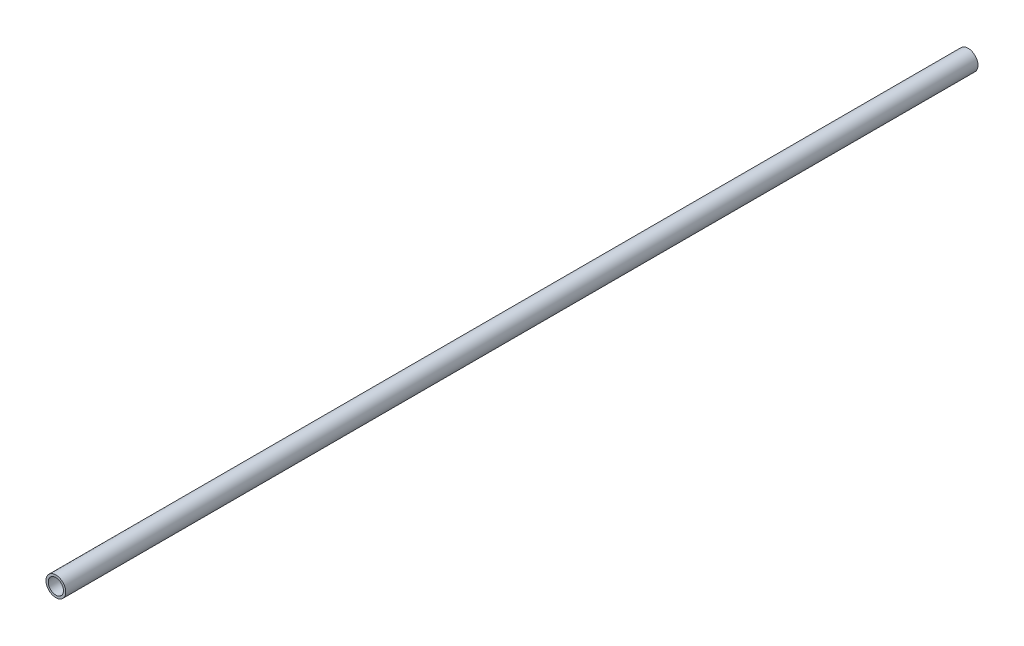
ISO-10303-21;
HEADER;
FILE_DESCRIPTION(('STEP AP214'),'2;1');
FILE_NAME('part.step','',(''),(''),'','','');
FILE_SCHEMA(('AUTOMOTIVE_DESIGN { 1 0 10303 214 1 1 1 1 }'));
ENDSEC;
DATA;
#1=APPLICATION_CONTEXT('core data for automotive mechanical design processes');
#2=APPLICATION_PROTOCOL_DEFINITION('international standard','automotive_design',2000,#1);
#3=PRODUCT_CONTEXT('',#1,'mechanical');
#4=PRODUCT('Part','Part','',(#3));
#5=PRODUCT_RELATED_PRODUCT_CATEGORY('part','',(#4));
#6=PRODUCT_DEFINITION_FORMATION('','',#4);
#7=PRODUCT_DEFINITION_CONTEXT('part definition',#1,'design');
#8=PRODUCT_DEFINITION('design','',#6,#7);
#9=PRODUCT_DEFINITION_SHAPE('','',#8);
#10=(LENGTH_UNIT() NAMED_UNIT(*) SI_UNIT(.MILLI.,.METRE.));
#11=(NAMED_UNIT(*) PLANE_ANGLE_UNIT() SI_UNIT($,.RADIAN.));
#12=(NAMED_UNIT(*) SI_UNIT($,.STERADIAN.) SOLID_ANGLE_UNIT());
#13=UNCERTAINTY_MEASURE_WITH_UNIT(LENGTH_MEASURE(1.E-05),#10,'distance_accuracy_value','');
#14=(GEOMETRIC_REPRESENTATION_CONTEXT(3) GLOBAL_UNCERTAINTY_ASSIGNED_CONTEXT((#13)) GLOBAL_UNIT_ASSIGNED_CONTEXT((#10,
#11,#12)) REPRESENTATION_CONTEXT('',''));
#15=CARTESIAN_POINT('',(0.,0.,0.));
#16=DIRECTION('',(0.,0.,1.));
#17=DIRECTION('',(1.,0.,0.));
#18=AXIS2_PLACEMENT_3D('',#15,#16,#17);
#19=CARTESIAN_POINT('',(0.,0.,600.));
#20=DIRECTION('',(0.,0.,1.));
#21=DIRECTION('',(1.,0.,0.));
#22=AXIS2_PLACEMENT_3D('',#19,#20,#21);
#23=PLANE('',#22);
#24=CARTESIAN_POINT('',(0.,0.,600.));
#25=DIRECTION('',(0.,0.,1.));
#26=DIRECTION('',(1.,0.,0.));
#27=AXIS2_PLACEMENT_3D('',#24,#25,#26);
#28=CIRCLE('',#27,6.5);
#29=CARTESIAN_POINT('',(6.5,0.,600.));
#30=VERTEX_POINT('',#29);
#31=EDGE_CURVE('E10',#30,#30,#28,.T.);
#32=ORIENTED_EDGE('',*,*,#31,.T.);
#33=EDGE_LOOP('',(#32));
#34=FACE_BOUND('',#33,.T.);
#35=CARTESIAN_POINT('',(0.,0.,600.));
#36=DIRECTION('',(0.,0.,1.));
#37=DIRECTION('',(1.,0.,0.));
#38=AXIS2_PLACEMENT_3D('',#35,#36,#37);
#39=CIRCLE('',#38,5.);
#40=CARTESIAN_POINT('',(5.,0.,600.));
#41=VERTEX_POINT('',#40);
#42=EDGE_CURVE('E56',#41,#41,#39,.T.);
#43=ORIENTED_EDGE('',*,*,#42,.F.);
#44=EDGE_LOOP('',(#43));
#45=FACE_BOUND('',#44,.T.);
#46=ADVANCED_FACE('F43',(#34,#45),#23,.T.);
#47=CARTESIAN_POINT('',(0.,0.,0.));
#48=DIRECTION('',(0.,0.,1.));
#49=DIRECTION('',(1.,0.,0.));
#50=AXIS2_PLACEMENT_3D('',#47,#48,#49);
#51=PLANE('',#50);
#52=CARTESIAN_POINT('',(0.,0.,0.));
#53=DIRECTION('',(0.,0.,1.));
#54=DIRECTION('',(1.,0.,0.));
#55=AXIS2_PLACEMENT_3D('',#52,#53,#54);
#56=CIRCLE('',#55,6.5);
#57=CARTESIAN_POINT('',(6.5,0.,0.));
#58=VERTEX_POINT('',#57);
#59=EDGE_CURVE('E47',#58,#58,#56,.T.);
#60=ORIENTED_EDGE('',*,*,#59,.F.);
#61=EDGE_LOOP('',(#60));
#62=FACE_BOUND('',#61,.T.);
#63=CARTESIAN_POINT('',(0.,0.,0.));
#64=DIRECTION('',(0.,0.,1.));
#65=DIRECTION('',(1.,0.,0.));
#66=AXIS2_PLACEMENT_3D('',#63,#64,#65);
#67=CIRCLE('',#66,5.);
#68=CARTESIAN_POINT('',(5.,0.,0.));
#69=VERTEX_POINT('',#68);
#70=EDGE_CURVE('E58',#69,#69,#67,.T.);
#71=ORIENTED_EDGE('',*,*,#70,.T.);
#72=EDGE_LOOP('',(#71));
#73=FACE_BOUND('',#72,.T.);
#74=ADVANCED_FACE('F70',(#62,#73),#51,.F.);
#75=CARTESIAN_POINT('',(0.,0.,600.));
#76=DIRECTION('',(0.,0.,-1.));
#77=DIRECTION('',(-1.,0.,0.));
#78=AXIS2_PLACEMENT_3D('',#75,#76,#77);
#79=CYLINDRICAL_SURFACE('',#78,6.5);
#80=ORIENTED_EDGE('',*,*,#31,.F.);
#81=EDGE_LOOP('',(#80));
#82=FACE_BOUND('',#81,.T.);
#83=ORIENTED_EDGE('',*,*,#59,.T.);
#84=EDGE_LOOP('',(#83));
#85=FACE_BOUND('',#84,.T.);
#86=ADVANCED_FACE('F45',(#82,#85),#79,.T.);
#87=CARTESIAN_POINT('',(0.,0.,600.));
#88=DIRECTION('',(0.,0.,-1.));
#89=DIRECTION('',(-1.,0.,0.));
#90=AXIS2_PLACEMENT_3D('',#87,#88,#89);
#91=CYLINDRICAL_SURFACE('',#90,5.);
#92=ORIENTED_EDGE('',*,*,#42,.T.);
#93=EDGE_LOOP('',(#92));
#94=FACE_BOUND('',#93,.T.);
#95=ORIENTED_EDGE('',*,*,#70,.F.);
#96=EDGE_LOOP('',(#95));
#97=FACE_BOUND('',#96,.T.);
#98=ADVANCED_FACE('F66',(#94,#97),#91,.F.);
#99=CLOSED_SHELL('',(#46,#74,#86,#98));
#100=MANIFOLD_SOLID_BREP('B2',#99);
#101=ADVANCED_BREP_SHAPE_REPRESENTATION('',(#18,#100),#14);
#102=SHAPE_DEFINITION_REPRESENTATION(#9,#101);
ENDSEC;
END-ISO-10303-21;
